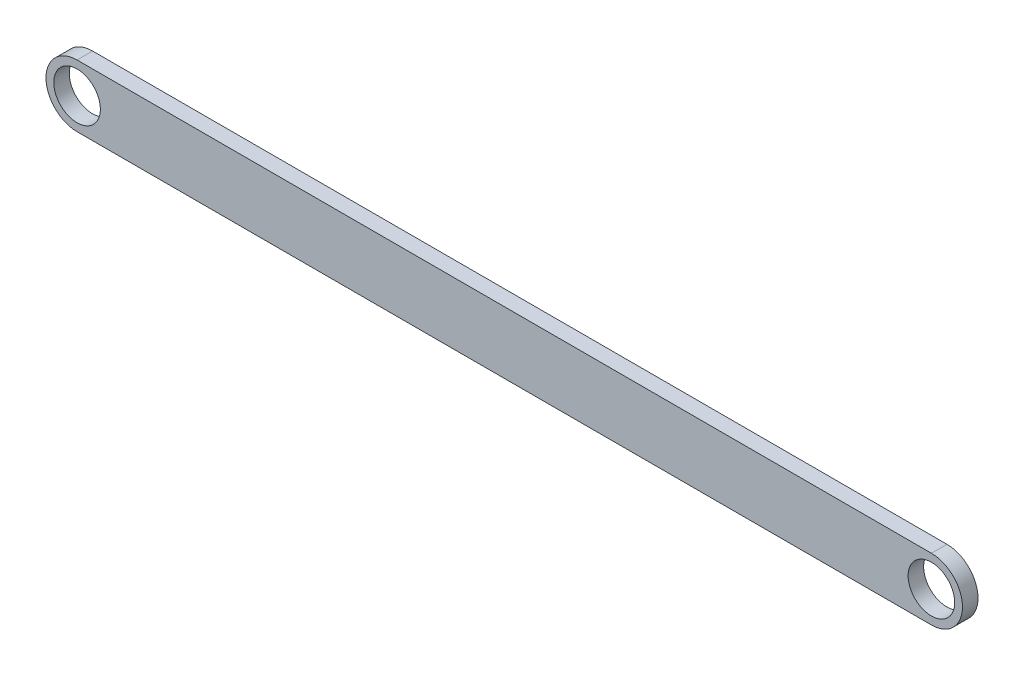
ISO-10303-21;
HEADER;
FILE_DESCRIPTION(('STEP AP214'),'2;1');
FILE_NAME('part.step','',(''),(''),'','','');
FILE_SCHEMA(('AUTOMOTIVE_DESIGN { 1 0 10303 214 1 1 1 1 }'));
ENDSEC;
DATA;
#1=APPLICATION_CONTEXT('core data for automotive mechanical design processes');
#2=APPLICATION_PROTOCOL_DEFINITION('international standard','automotive_design',2000,#1);
#3=PRODUCT_CONTEXT('',#1,'mechanical');
#4=PRODUCT('Part','Part','',(#3));
#5=PRODUCT_RELATED_PRODUCT_CATEGORY('part','',(#4));
#6=PRODUCT_DEFINITION_FORMATION('','',#4);
#7=PRODUCT_DEFINITION_CONTEXT('part definition',#1,'design');
#8=PRODUCT_DEFINITION('design','',#6,#7);
#9=PRODUCT_DEFINITION_SHAPE('','',#8);
#10=(LENGTH_UNIT() NAMED_UNIT(*) SI_UNIT(.MILLI.,.METRE.));
#11=(NAMED_UNIT(*) PLANE_ANGLE_UNIT() SI_UNIT($,.RADIAN.));
#12=(NAMED_UNIT(*) SI_UNIT($,.STERADIAN.) SOLID_ANGLE_UNIT());
#13=UNCERTAINTY_MEASURE_WITH_UNIT(LENGTH_MEASURE(1.E-05),#10,'distance_accuracy_value','');
#14=(GEOMETRIC_REPRESENTATION_CONTEXT(3) GLOBAL_UNCERTAINTY_ASSIGNED_CONTEXT((#13)) GLOBAL_UNIT_ASSIGNED_CONTEXT((#10,
#11,#12)) REPRESENTATION_CONTEXT('',''));
#15=CARTESIAN_POINT('',(0.,0.,0.));
#16=DIRECTION('',(0.,0.,1.));
#17=DIRECTION('',(1.,0.,0.));
#18=AXIS2_PLACEMENT_3D('',#15,#16,#17);
#19=CARTESIAN_POINT('',(0.,0.,10.));
#20=DIRECTION('',(0.,0.,1.));
#21=DIRECTION('',(1.,0.,0.));
#22=AXIS2_PLACEMENT_3D('',#19,#20,#21);
#23=PLANE('',#22);
#24=CARTESIAN_POINT('',(0.,0.,10.));
#25=DIRECTION('',(0.,0.,1.));
#26=DIRECTION('',(1.,0.,0.));
#27=AXIS2_PLACEMENT_3D('',#24,#25,#26);
#28=CIRCLE('',#27,15.);
#29=CARTESIAN_POINT('',(15.,0.,10.));
#30=VERTEX_POINT('',#29);
#31=EDGE_CURVE('E116',#30,#30,#28,.T.);
#32=ORIENTED_EDGE('',*,*,#31,.F.);
#33=EDGE_LOOP('',(#32));
#34=FACE_BOUND('',#33,.T.);
#35=CARTESIAN_POINT('',(0.,0.,10.));
#36=DIRECTION('',(0.,0.,1.));
#37=DIRECTION('',(1.,0.,0.));
#38=AXIS2_PLACEMENT_3D('',#35,#36,#37);
#39=CIRCLE('',#38,20.);
#40=CARTESIAN_POINT('',(0.,20.,10.));
#41=VERTEX_POINT('',#40);
#42=CARTESIAN_POINT('',(0.,-20.,10.));
#43=VERTEX_POINT('',#42);
#44=EDGE_CURVE('E96',#41,#43,#39,.T.);
#45=ORIENTED_EDGE('',*,*,#44,.T.);
#46=DIRECTION('',(1.,0.,0.));
#47=VECTOR('',#46,1.);
#48=CARTESIAN_POINT('',(0.,-20.,10.));
#49=LINE('',#48,#47);
#50=CARTESIAN_POINT('',(550.,-20.,10.));
#51=VERTEX_POINT('',#50);
#52=EDGE_CURVE('E91',#43,#51,#49,.T.);
#53=ORIENTED_EDGE('',*,*,#52,.T.);
#54=CARTESIAN_POINT('',(550.,0.,10.));
#55=DIRECTION('',(0.,0.,1.));
#56=DIRECTION('',(1.,0.,0.));
#57=AXIS2_PLACEMENT_3D('',#54,#55,#56);
#58=CIRCLE('',#57,20.);
#59=CARTESIAN_POINT('',(550.,20.,10.));
#60=VERTEX_POINT('',#59);
#61=EDGE_CURVE('E94',#51,#60,#58,.T.);
#62=ORIENTED_EDGE('',*,*,#61,.T.);
#63=DIRECTION('',(-1.,0.,0.));
#64=VECTOR('',#63,1.);
#65=CARTESIAN_POINT('',(0.,20.,10.));
#66=LINE('',#65,#64);
#67=EDGE_CURVE('E61',#60,#41,#66,.T.);
#68=ORIENTED_EDGE('',*,*,#67,.T.);
#69=EDGE_LOOP('',(#45,#53,#62,#68));
#70=FACE_BOUND('',#69,.T.);
#71=CARTESIAN_POINT('',(550.,0.,10.));
#72=DIRECTION('',(0.,0.,1.));
#73=DIRECTION('',(1.,0.,0.));
#74=AXIS2_PLACEMENT_3D('',#71,#72,#73);
#75=CIRCLE('',#74,15.);
#76=CARTESIAN_POINT('',(565.,0.,10.));
#77=VERTEX_POINT('',#76);
#78=EDGE_CURVE('E138',#77,#77,#75,.T.);
#79=ORIENTED_EDGE('',*,*,#78,.F.);
#80=EDGE_LOOP('',(#79));
#81=FACE_BOUND('',#80,.T.);
#82=ADVANCED_FACE('F43',(#34,#70,#81),#23,.T.);
#83=CARTESIAN_POINT('',(0.,0.,0.));
#84=DIRECTION('',(0.,0.,1.));
#85=DIRECTION('',(1.,0.,0.));
#86=AXIS2_PLACEMENT_3D('',#83,#84,#85);
#87=PLANE('',#86);
#88=CARTESIAN_POINT('',(0.,0.,0.));
#89=DIRECTION('',(0.,0.,1.));
#90=DIRECTION('',(1.,0.,0.));
#91=AXIS2_PLACEMENT_3D('',#88,#89,#90);
#92=CIRCLE('',#91,20.);
#93=CARTESIAN_POINT('',(0.,20.,0.));
#94=VERTEX_POINT('',#93);
#95=CARTESIAN_POINT('',(0.,-20.,0.));
#96=VERTEX_POINT('',#95);
#97=EDGE_CURVE('E112',#94,#96,#92,.T.);
#98=ORIENTED_EDGE('',*,*,#97,.F.);
#99=DIRECTION('',(-1.,0.,0.));
#100=VECTOR('',#99,1.);
#101=CARTESIAN_POINT('',(0.,20.,0.));
#102=LINE('',#101,#100);
#103=CARTESIAN_POINT('',(550.,20.,0.));
#104=VERTEX_POINT('',#103);
#105=EDGE_CURVE('E84',#104,#94,#102,.T.);
#106=ORIENTED_EDGE('',*,*,#105,.F.);
#107=CARTESIAN_POINT('',(550.,0.,0.));
#108=DIRECTION('',(0.,0.,1.));
#109=DIRECTION('',(1.,0.,0.));
#110=AXIS2_PLACEMENT_3D('',#107,#108,#109);
#111=CIRCLE('',#110,20.);
#112=CARTESIAN_POINT('',(550.,-20.,0.));
#113=VERTEX_POINT('',#112);
#114=EDGE_CURVE('E78',#113,#104,#111,.T.);
#115=ORIENTED_EDGE('',*,*,#114,.F.);
#116=DIRECTION('',(1.,0.,0.));
#117=VECTOR('',#116,1.);
#118=CARTESIAN_POINT('',(0.,-20.,0.));
#119=LINE('',#118,#117);
#120=EDGE_CURVE('E101',#96,#113,#119,.T.);
#121=ORIENTED_EDGE('',*,*,#120,.F.);
#122=EDGE_LOOP('',(#98,#106,#115,#121));
#123=FACE_BOUND('',#122,.T.);
#124=CARTESIAN_POINT('',(0.,0.,0.));
#125=DIRECTION('',(0.,0.,1.));
#126=DIRECTION('',(1.,0.,0.));
#127=AXIS2_PLACEMENT_3D('',#124,#125,#126);
#128=CIRCLE('',#127,15.);
#129=CARTESIAN_POINT('',(15.,0.,0.));
#130=VERTEX_POINT('',#129);
#131=EDGE_CURVE('E134',#130,#130,#128,.T.);
#132=ORIENTED_EDGE('',*,*,#131,.T.);
#133=EDGE_LOOP('',(#132));
#134=FACE_BOUND('',#133,.T.);
#135=CARTESIAN_POINT('',(550.,0.,0.));
#136=DIRECTION('',(0.,0.,1.));
#137=DIRECTION('',(1.,0.,0.));
#138=AXIS2_PLACEMENT_3D('',#135,#136,#137);
#139=CIRCLE('',#138,15.);
#140=CARTESIAN_POINT('',(565.,0.,0.));
#141=VERTEX_POINT('',#140);
#142=EDGE_CURVE('E142',#141,#141,#139,.T.);
#143=ORIENTED_EDGE('',*,*,#142,.T.);
#144=EDGE_LOOP('',(#143));
#145=FACE_BOUND('',#144,.T.);
#146=ADVANCED_FACE('F129',(#123,#134,#145),#87,.F.);
#147=CARTESIAN_POINT('',(0.,0.,10.));
#148=DIRECTION('',(0.,0.,-1.));
#149=DIRECTION('',(-1.,0.,0.));
#150=AXIS2_PLACEMENT_3D('',#147,#148,#149);
#151=CYLINDRICAL_SURFACE('',#150,20.);
#152=ORIENTED_EDGE('',*,*,#97,.T.);
#153=DIRECTION('',(0.,0.,-1.));
#154=VECTOR('',#153,1.);
#155=CARTESIAN_POINT('',(0.,-20.,10.));
#156=LINE('',#155,#154);
#157=EDGE_CURVE('E11',#43,#96,#156,.T.);
#158=ORIENTED_EDGE('',*,*,#157,.F.);
#159=ORIENTED_EDGE('',*,*,#44,.F.);
#160=DIRECTION('',(0.,0.,-1.));
#161=VECTOR('',#160,1.);
#162=CARTESIAN_POINT('',(0.,20.,10.));
#163=LINE('',#162,#161);
#164=EDGE_CURVE('E108',#41,#94,#163,.T.);
#165=ORIENTED_EDGE('',*,*,#164,.T.);
#166=EDGE_LOOP('',(#152,#158,#159,#165));
#167=FACE_BOUND('',#166,.T.);
#168=ADVANCED_FACE('F45',(#167),#151,.T.);
#169=CARTESIAN_POINT('',(0.,-20.,10.));
#170=DIRECTION('',(0.,1.,0.));
#171=DIRECTION('',(-1.,0.,0.));
#172=AXIS2_PLACEMENT_3D('',#169,#170,#171);
#173=PLANE('',#172);
#174=ORIENTED_EDGE('',*,*,#120,.T.);
#175=DIRECTION('',(0.,0.,-1.));
#176=VECTOR('',#175,1.);
#177=CARTESIAN_POINT('',(550.,-20.,10.));
#178=LINE('',#177,#176);
#179=EDGE_CURVE('E53',#51,#113,#178,.T.);
#180=ORIENTED_EDGE('',*,*,#179,.F.);
#181=ORIENTED_EDGE('',*,*,#52,.F.);
#182=ORIENTED_EDGE('',*,*,#157,.T.);
#183=EDGE_LOOP('',(#174,#180,#181,#182));
#184=FACE_BOUND('',#183,.T.);
#185=ADVANCED_FACE('F100',(#184),#173,.F.);
#186=CARTESIAN_POINT('',(550.,0.,10.));
#187=DIRECTION('',(0.,0.,-1.));
#188=DIRECTION('',(-1.,0.,0.));
#189=AXIS2_PLACEMENT_3D('',#186,#187,#188);
#190=CYLINDRICAL_SURFACE('',#189,20.);
#191=ORIENTED_EDGE('',*,*,#114,.T.);
#192=DIRECTION('',(0.,0.,-1.));
#193=VECTOR('',#192,1.);
#194=CARTESIAN_POINT('',(550.,20.,10.));
#195=LINE('',#194,#193);
#196=EDGE_CURVE('E103',#60,#104,#195,.T.);
#197=ORIENTED_EDGE('',*,*,#196,.F.);
#198=ORIENTED_EDGE('',*,*,#61,.F.);
#199=ORIENTED_EDGE('',*,*,#179,.T.);
#200=EDGE_LOOP('',(#191,#197,#198,#199));
#201=FACE_BOUND('',#200,.T.);
#202=ADVANCED_FACE('F104',(#201),#190,.T.);
#203=CARTESIAN_POINT('',(0.,20.,10.));
#204=DIRECTION('',(0.,-1.,0.));
#205=DIRECTION('',(1.,0.,0.));
#206=AXIS2_PLACEMENT_3D('',#203,#204,#205);
#207=PLANE('',#206);
#208=ORIENTED_EDGE('',*,*,#105,.T.);
#209=ORIENTED_EDGE('',*,*,#164,.F.);
#210=ORIENTED_EDGE('',*,*,#67,.F.);
#211=ORIENTED_EDGE('',*,*,#196,.T.);
#212=EDGE_LOOP('',(#208,#209,#210,#211));
#213=FACE_BOUND('',#212,.T.);
#214=ADVANCED_FACE('F126',(#213),#207,.F.);
#215=CARTESIAN_POINT('',(0.,0.,10.));
#216=DIRECTION('',(0.,0.,-1.));
#217=DIRECTION('',(-1.,0.,0.));
#218=AXIS2_PLACEMENT_3D('',#215,#216,#217);
#219=CYLINDRICAL_SURFACE('',#218,15.);
#220=ORIENTED_EDGE('',*,*,#31,.T.);
#221=EDGE_LOOP('',(#220));
#222=FACE_BOUND('',#221,.T.);
#223=ORIENTED_EDGE('',*,*,#131,.F.);
#224=EDGE_LOOP('',(#223));
#225=FACE_BOUND('',#224,.T.);
#226=ADVANCED_FACE('F161',(#222,#225),#219,.F.);
#227=CARTESIAN_POINT('',(550.,0.,10.));
#228=DIRECTION('',(0.,0.,-1.));
#229=DIRECTION('',(-1.,0.,0.));
#230=AXIS2_PLACEMENT_3D('',#227,#228,#229);
#231=CYLINDRICAL_SURFACE('',#230,15.);
#232=ORIENTED_EDGE('',*,*,#78,.T.);
#233=EDGE_LOOP('',(#232));
#234=FACE_BOUND('',#233,.T.);
#235=ORIENTED_EDGE('',*,*,#142,.F.);
#236=EDGE_LOOP('',(#235));
#237=FACE_BOUND('',#236,.T.);
#238=ADVANCED_FACE('F150',(#234,#237),#231,.F.);
#239=CLOSED_SHELL('',(#82,#146,#168,#185,#202,#214,#226,#238));
#240=MANIFOLD_SOLID_BREP('B2',#239);
#241=ADVANCED_BREP_SHAPE_REPRESENTATION('',(#18,#240),#14);
#242=SHAPE_DEFINITION_REPRESENTATION(#9,#241);
ENDSEC;
END-ISO-10303-21;
